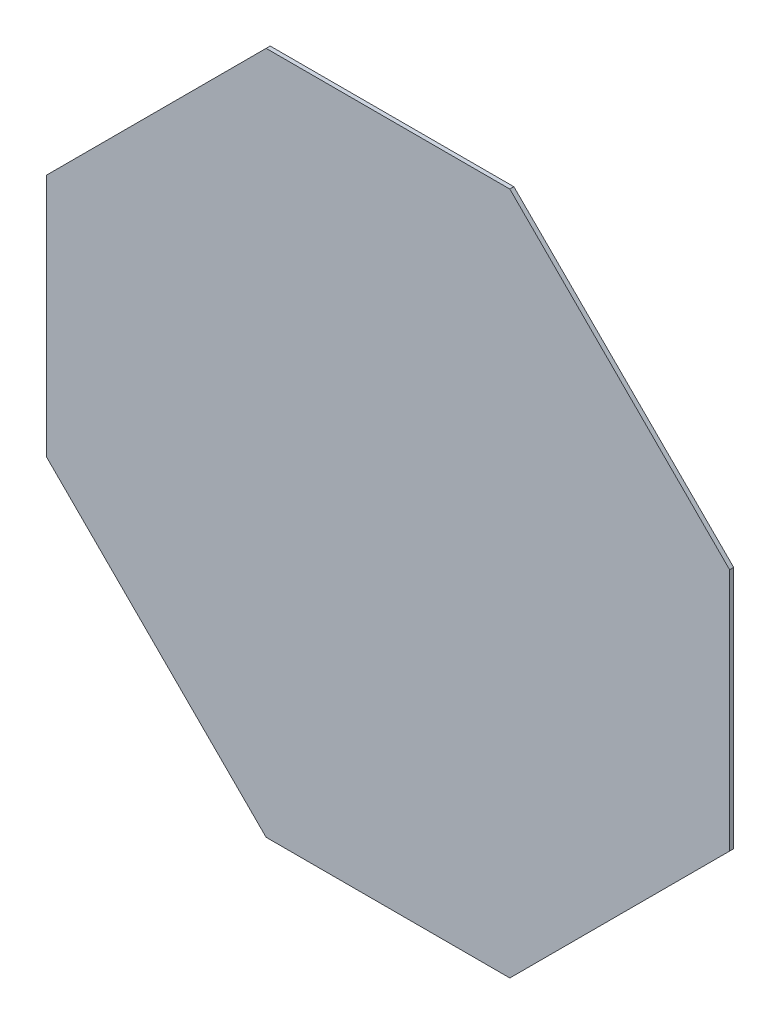
ISO-10303-21;
HEADER;
FILE_DESCRIPTION(('STEP AP214'),'2;1');
FILE_NAME('part.step','',(''),(''),'','','');
FILE_SCHEMA(('AUTOMOTIVE_DESIGN { 1 0 10303 214 1 1 1 1 }'));
ENDSEC;
DATA;
#1=APPLICATION_CONTEXT('core data for automotive mechanical design processes');
#2=APPLICATION_PROTOCOL_DEFINITION('international standard','automotive_design',2000,#1);
#3=PRODUCT_CONTEXT('',#1,'mechanical');
#4=PRODUCT('Part','Part','',(#3));
#5=PRODUCT_RELATED_PRODUCT_CATEGORY('part','',(#4));
#6=PRODUCT_DEFINITION_FORMATION('','',#4);
#7=PRODUCT_DEFINITION_CONTEXT('part definition',#1,'design');
#8=PRODUCT_DEFINITION('design','',#6,#7);
#9=PRODUCT_DEFINITION_SHAPE('','',#8);
#10=(LENGTH_UNIT() NAMED_UNIT(*) SI_UNIT(.MILLI.,.METRE.));
#11=(NAMED_UNIT(*) PLANE_ANGLE_UNIT() SI_UNIT($,.RADIAN.));
#12=(NAMED_UNIT(*) SI_UNIT($,.STERADIAN.) SOLID_ANGLE_UNIT());
#13=UNCERTAINTY_MEASURE_WITH_UNIT(LENGTH_MEASURE(1.E-05),#10,'distance_accuracy_value','');
#14=(GEOMETRIC_REPRESENTATION_CONTEXT(3) GLOBAL_UNCERTAINTY_ASSIGNED_CONTEXT((#13)) GLOBAL_UNIT_ASSIGNED_CONTEXT((#10,
#11,#12)) REPRESENTATION_CONTEXT('',''));
#15=CARTESIAN_POINT('',(0.,0.,0.));
#16=DIRECTION('',(0.,0.,1.));
#17=DIRECTION('',(1.,0.,0.));
#18=AXIS2_PLACEMENT_3D('',#15,#16,#17);
#19=CARTESIAN_POINT('',(164.,-340.242640687119,3.));
#20=DIRECTION('',(-1.,0.,0.));
#21=DIRECTION('',(0.,0.,1.));
#22=AXIS2_PLACEMENT_3D('',#19,#20,#21);
#23=PLANE('',#22);
#24=DIRECTION('',(0.,1.,0.));
#25=VECTOR('',#24,1.);
#26=CARTESIAN_POINT('',(164.,-340.242640687119,0.));
#27=LINE('',#26,#25);
#28=CARTESIAN_POINT('',(164.,-340.242640687119,0.));
#29=VERTEX_POINT('',#28);
#30=CARTESIAN_POINT('',(164.,-159.757359312881,0.));
#31=VERTEX_POINT('',#30);
#32=EDGE_CURVE('E133',#29,#31,#27,.T.);
#33=ORIENTED_EDGE('',*,*,#32,.T.);
#34=DIRECTION('',(0.,0.,-1.));
#35=VECTOR('',#34,1.);
#36=CARTESIAN_POINT('',(164.,-159.757359312881,3.));
#37=LINE('',#36,#35);
#38=CARTESIAN_POINT('',(164.,-159.757359312881,3.));
#39=VERTEX_POINT('',#38);
#40=EDGE_CURVE('E11',#39,#31,#37,.T.);
#41=ORIENTED_EDGE('',*,*,#40,.F.);
#42=DIRECTION('',(0.,1.,0.));
#43=VECTOR('',#42,1.);
#44=CARTESIAN_POINT('',(164.,-340.242640687119,3.));
#45=LINE('',#44,#43);
#46=CARTESIAN_POINT('',(164.,-340.242640687119,3.));
#47=VERTEX_POINT('',#46);
#48=EDGE_CURVE('E147',#47,#39,#45,.T.);
#49=ORIENTED_EDGE('',*,*,#48,.F.);
#50=DIRECTION('',(0.,0.,-1.));
#51=VECTOR('',#50,1.);
#52=CARTESIAN_POINT('',(164.,-340.242640687119,3.));
#53=LINE('',#52,#51);
#54=EDGE_CURVE('E129',#47,#29,#53,.T.);
#55=ORIENTED_EDGE('',*,*,#54,.T.);
#56=EDGE_LOOP('',(#33,#41,#49,#55));
#57=FACE_BOUND('',#56,.T.);
#58=ADVANCED_FACE('F37',(#57),#23,.F.);
#59=CARTESIAN_POINT('',(164.,-159.757359312881,3.));
#60=DIRECTION('',(-0.707106781186547,-0.707106781186548,0.));
#61=DIRECTION('',(0.707106781186548,-0.707106781186547,0.));
#62=AXIS2_PLACEMENT_3D('',#59,#60,#61);
#63=PLANE('',#62);
#64=DIRECTION('',(-0.707106781186548,0.707106781186547,0.));
#65=VECTOR('',#64,1.);
#66=CARTESIAN_POINT('',(164.,-159.757359312881,0.));
#67=LINE('',#66,#65);
#68=CARTESIAN_POINT('',(1.24264068711928,2.99999999999997,0.));
#69=VERTEX_POINT('',#68);
#70=EDGE_CURVE('E136',#31,#69,#67,.T.);
#71=ORIENTED_EDGE('',*,*,#70,.T.);
#72=DIRECTION('',(0.,0.,-1.));
#73=VECTOR('',#72,1.);
#74=CARTESIAN_POINT('',(1.24264068711928,2.99999999999997,3.));
#75=LINE('',#74,#73);
#76=CARTESIAN_POINT('',(1.24264068711928,2.99999999999997,3.));
#77=VERTEX_POINT('',#76);
#78=EDGE_CURVE('E45',#77,#69,#75,.T.);
#79=ORIENTED_EDGE('',*,*,#78,.F.);
#80=DIRECTION('',(-0.707106781186548,0.707106781186547,0.));
#81=VECTOR('',#80,1.);
#82=CARTESIAN_POINT('',(164.,-159.757359312881,3.));
#83=LINE('',#82,#81);
#84=EDGE_CURVE('E96',#39,#77,#83,.T.);
#85=ORIENTED_EDGE('',*,*,#84,.F.);
#86=ORIENTED_EDGE('',*,*,#40,.T.);
#87=EDGE_LOOP('',(#71,#79,#85,#86));
#88=FACE_BOUND('',#87,.T.);
#89=ADVANCED_FACE('F182',(#88),#63,.F.);
#90=CARTESIAN_POINT('',(1.24264068711928,2.99999999999997,3.));
#91=DIRECTION('',(0.,-1.,0.));
#92=DIRECTION('',(1.,0.,0.));
#93=AXIS2_PLACEMENT_3D('',#90,#91,#92);
#94=PLANE('',#93);
#95=DIRECTION('',(-1.,0.,0.));
#96=VECTOR('',#95,1.);
#97=CARTESIAN_POINT('',(1.24264068711928,2.99999999999997,0.));
#98=LINE('',#97,#96);
#99=CARTESIAN_POINT('',(-179.242640687119,2.99999999999994,0.));
#100=VERTEX_POINT('',#99);
#101=EDGE_CURVE('E138',#69,#100,#98,.T.);
#102=ORIENTED_EDGE('',*,*,#101,.T.);
#103=DIRECTION('',(0.,0.,-1.));
#104=VECTOR('',#103,1.);
#105=CARTESIAN_POINT('',(-179.242640687119,2.99999999999994,3.));
#106=LINE('',#105,#104);
#107=CARTESIAN_POINT('',(-179.242640687119,2.99999999999994,3.));
#108=VERTEX_POINT('',#107);
#109=EDGE_CURVE('E154',#108,#100,#106,.T.);
#110=ORIENTED_EDGE('',*,*,#109,.F.);
#111=DIRECTION('',(-1.,0.,0.));
#112=VECTOR('',#111,1.);
#113=CARTESIAN_POINT('',(1.24264068711928,2.99999999999997,3.));
#114=LINE('',#113,#112);
#115=EDGE_CURVE('E162',#77,#108,#114,.T.);
#116=ORIENTED_EDGE('',*,*,#115,.F.);
#117=ORIENTED_EDGE('',*,*,#78,.T.);
#118=EDGE_LOOP('',(#102,#110,#116,#117));
#119=FACE_BOUND('',#118,.T.);
#120=ADVANCED_FACE('F160',(#119),#94,.F.);
#121=CARTESIAN_POINT('',(-179.242640687119,2.99999999999994,3.));
#122=DIRECTION('',(0.707106781186547,-0.707106781186548,0.));
#123=DIRECTION('',(0.707106781186548,0.707106781186547,0.));
#124=AXIS2_PLACEMENT_3D('',#121,#122,#123);
#125=PLANE('',#124);
#126=DIRECTION('',(-0.707106781186548,-0.707106781186547,0.));
#127=VECTOR('',#126,1.);
#128=CARTESIAN_POINT('',(-179.242640687119,2.99999999999994,0.));
#129=LINE('',#128,#127);
#130=CARTESIAN_POINT('',(-342.,-159.757359312881,0.));
#131=VERTEX_POINT('',#130);
#132=EDGE_CURVE('E140',#100,#131,#129,.T.);
#133=ORIENTED_EDGE('',*,*,#132,.T.);
#134=DIRECTION('',(0.,0.,-1.));
#135=VECTOR('',#134,1.);
#136=CARTESIAN_POINT('',(-342.,-159.757359312881,3.));
#137=LINE('',#136,#135);
#138=CARTESIAN_POINT('',(-342.,-159.757359312881,3.));
#139=VERTEX_POINT('',#138);
#140=EDGE_CURVE('E151',#139,#131,#137,.T.);
#141=ORIENTED_EDGE('',*,*,#140,.F.);
#142=DIRECTION('',(-0.707106781186548,-0.707106781186547,0.));
#143=VECTOR('',#142,1.);
#144=CARTESIAN_POINT('',(-179.242640687119,2.99999999999994,3.));
#145=LINE('',#144,#143);
#146=EDGE_CURVE('E174',#108,#139,#145,.T.);
#147=ORIENTED_EDGE('',*,*,#146,.F.);
#148=ORIENTED_EDGE('',*,*,#109,.T.);
#149=EDGE_LOOP('',(#133,#141,#147,#148));
#150=FACE_BOUND('',#149,.T.);
#151=ADVANCED_FACE('F170',(#150),#125,.F.);
#152=CARTESIAN_POINT('',(-342.,-159.757359312881,3.));
#153=DIRECTION('',(1.,0.,0.));
#154=DIRECTION('',(0.,0.,-1.));
#155=AXIS2_PLACEMENT_3D('',#152,#153,#154);
#156=PLANE('',#155);
#157=DIRECTION('',(0.,-1.,0.));
#158=VECTOR('',#157,1.);
#159=CARTESIAN_POINT('',(-342.,-159.757359312881,0.));
#160=LINE('',#159,#158);
#161=CARTESIAN_POINT('',(-342.,-340.242640687119,0.));
#162=VERTEX_POINT('',#161);
#163=EDGE_CURVE('E142',#131,#162,#160,.T.);
#164=ORIENTED_EDGE('',*,*,#163,.T.);
#165=DIRECTION('',(0.,0.,-1.));
#166=VECTOR('',#165,1.);
#167=CARTESIAN_POINT('',(-342.,-340.242640687119,3.));
#168=LINE('',#167,#166);
#169=CARTESIAN_POINT('',(-342.,-340.242640687119,3.));
#170=VERTEX_POINT('',#169);
#171=EDGE_CURVE('E124',#170,#162,#168,.T.);
#172=ORIENTED_EDGE('',*,*,#171,.F.);
#173=DIRECTION('',(0.,-1.,0.));
#174=VECTOR('',#173,1.);
#175=CARTESIAN_POINT('',(-342.,-159.757359312881,3.));
#176=LINE('',#175,#174);
#177=EDGE_CURVE('E115',#139,#170,#176,.T.);
#178=ORIENTED_EDGE('',*,*,#177,.F.);
#179=ORIENTED_EDGE('',*,*,#140,.T.);
#180=EDGE_LOOP('',(#164,#172,#178,#179));
#181=FACE_BOUND('',#180,.T.);
#182=ADVANCED_FACE('F173',(#181),#156,.F.);
#183=CARTESIAN_POINT('',(-342.,-340.242640687119,3.));
#184=DIRECTION('',(0.707106781186548,0.707106781186547,0.));
#185=DIRECTION('',(-0.707106781186547,0.707106781186548,0.));
#186=AXIS2_PLACEMENT_3D('',#183,#184,#185);
#187=PLANE('',#186);
#188=DIRECTION('',(0.707106781186547,-0.707106781186548,0.));
#189=VECTOR('',#188,1.);
#190=CARTESIAN_POINT('',(-342.,-340.242640687119,0.));
#191=LINE('',#190,#189);
#192=CARTESIAN_POINT('',(-179.242640687119,-503.,0.));
#193=VERTEX_POINT('',#192);
#194=EDGE_CURVE('E123',#162,#193,#191,.T.);
#195=ORIENTED_EDGE('',*,*,#194,.T.);
#196=DIRECTION('',(0.,0.,-1.));
#197=VECTOR('',#196,1.);
#198=CARTESIAN_POINT('',(-179.242640687119,-503.,3.));
#199=LINE('',#198,#197);
#200=CARTESIAN_POINT('',(-179.242640687119,-503.,3.));
#201=VERTEX_POINT('',#200);
#202=EDGE_CURVE('E120',#201,#193,#199,.T.);
#203=ORIENTED_EDGE('',*,*,#202,.F.);
#204=DIRECTION('',(0.707106781186547,-0.707106781186548,0.));
#205=VECTOR('',#204,1.);
#206=CARTESIAN_POINT('',(-342.,-340.242640687119,3.));
#207=LINE('',#206,#205);
#208=EDGE_CURVE('E109',#170,#201,#207,.T.);
#209=ORIENTED_EDGE('',*,*,#208,.F.);
#210=ORIENTED_EDGE('',*,*,#171,.T.);
#211=EDGE_LOOP('',(#195,#203,#209,#210));
#212=FACE_BOUND('',#211,.T.);
#213=ADVANCED_FACE('F121',(#212),#187,.F.);
#214=CARTESIAN_POINT('',(-179.242640687119,-503.,3.));
#215=DIRECTION('',(0.,1.,0.));
#216=DIRECTION('',(0.,0.,1.));
#217=AXIS2_PLACEMENT_3D('',#214,#215,#216);
#218=PLANE('',#217);
#219=DIRECTION('',(1.,0.,0.));
#220=VECTOR('',#219,1.);
#221=CARTESIAN_POINT('',(-179.242640687119,-503.,0.));
#222=LINE('',#221,#220);
#223=CARTESIAN_POINT('',(1.24264068711931,-503.,0.));
#224=VERTEX_POINT('',#223);
#225=EDGE_CURVE('E82',#193,#224,#222,.T.);
#226=ORIENTED_EDGE('',*,*,#225,.T.);
#227=DIRECTION('',(0.,0.,-1.));
#228=VECTOR('',#227,1.);
#229=CARTESIAN_POINT('',(1.24264068711931,-503.,3.));
#230=LINE('',#229,#228);
#231=CARTESIAN_POINT('',(1.24264068711931,-503.,3.));
#232=VERTEX_POINT('',#231);
#233=EDGE_CURVE('E125',#232,#224,#230,.T.);
#234=ORIENTED_EDGE('',*,*,#233,.F.);
#235=DIRECTION('',(1.,0.,0.));
#236=VECTOR('',#235,1.);
#237=CARTESIAN_POINT('',(-179.242640687119,-503.,3.));
#238=LINE('',#237,#236);
#239=EDGE_CURVE('E113',#201,#232,#238,.T.);
#240=ORIENTED_EDGE('',*,*,#239,.F.);
#241=ORIENTED_EDGE('',*,*,#202,.T.);
#242=EDGE_LOOP('',(#226,#234,#240,#241));
#243=FACE_BOUND('',#242,.T.);
#244=ADVANCED_FACE('F127',(#243),#218,.F.);
#245=CARTESIAN_POINT('',(1.24264068711931,-503.,3.));
#246=DIRECTION('',(-0.707106781186548,0.707106781186547,0.));
#247=DIRECTION('',(-0.707106781186547,-0.707106781186548,0.));
#248=AXIS2_PLACEMENT_3D('',#245,#246,#247);
#249=PLANE('',#248);
#250=DIRECTION('',(0.707106781186547,0.707106781186548,0.));
#251=VECTOR('',#250,1.);
#252=CARTESIAN_POINT('',(1.24264068711931,-503.,0.));
#253=LINE('',#252,#251);
#254=EDGE_CURVE('E88',#224,#29,#253,.T.);
#255=ORIENTED_EDGE('',*,*,#254,.T.);
#256=ORIENTED_EDGE('',*,*,#54,.F.);
#257=DIRECTION('',(0.707106781186547,0.707106781186548,0.));
#258=VECTOR('',#257,1.);
#259=CARTESIAN_POINT('',(1.24264068711931,-503.,3.));
#260=LINE('',#259,#258);
#261=EDGE_CURVE('E53',#232,#47,#260,.T.);
#262=ORIENTED_EDGE('',*,*,#261,.F.);
#263=ORIENTED_EDGE('',*,*,#233,.T.);
#264=EDGE_LOOP('',(#255,#256,#262,#263));
#265=FACE_BOUND('',#264,.T.);
#266=ADVANCED_FACE('F198',(#265),#249,.F.);
#267=CARTESIAN_POINT('',(0.,0.,3.));
#268=DIRECTION('',(0.,0.,1.));
#269=DIRECTION('',(1.,0.,0.));
#270=AXIS2_PLACEMENT_3D('',#267,#268,#269);
#271=PLANE('',#270);
#272=ORIENTED_EDGE('',*,*,#48,.T.);
#273=ORIENTED_EDGE('',*,*,#84,.T.);
#274=ORIENTED_EDGE('',*,*,#115,.T.);
#275=ORIENTED_EDGE('',*,*,#146,.T.);
#276=ORIENTED_EDGE('',*,*,#177,.T.);
#277=ORIENTED_EDGE('',*,*,#208,.T.);
#278=ORIENTED_EDGE('',*,*,#239,.T.);
#279=ORIENTED_EDGE('',*,*,#261,.T.);
#280=EDGE_LOOP('',(#272,#273,#274,#275,#276,#277,#278,#279));
#281=FACE_BOUND('',#280,.T.);
#282=ADVANCED_FACE('F111',(#281),#271,.T.);
#283=CARTESIAN_POINT('',(0.,0.,0.));
#284=DIRECTION('',(0.,0.,1.));
#285=DIRECTION('',(1.,0.,0.));
#286=AXIS2_PLACEMENT_3D('',#283,#284,#285);
#287=PLANE('',#286);
#288=ORIENTED_EDGE('',*,*,#32,.F.);
#289=ORIENTED_EDGE('',*,*,#254,.F.);
#290=ORIENTED_EDGE('',*,*,#225,.F.);
#291=ORIENTED_EDGE('',*,*,#194,.F.);
#292=ORIENTED_EDGE('',*,*,#163,.F.);
#293=ORIENTED_EDGE('',*,*,#132,.F.);
#294=ORIENTED_EDGE('',*,*,#101,.F.);
#295=ORIENTED_EDGE('',*,*,#70,.F.);
#296=EDGE_LOOP('',(#288,#289,#290,#291,#292,#293,#294,#295));
#297=FACE_BOUND('',#296,.T.);
#298=ADVANCED_FACE('F166',(#297),#287,.F.);
#299=CLOSED_SHELL('',(#58,#89,#120,#151,#182,#213,#244,#266,#282,#298));
#300=MANIFOLD_SOLID_BREP('B2',#299);
#301=ADVANCED_BREP_SHAPE_REPRESENTATION('',(#18,#300),#14);
#302=SHAPE_DEFINITION_REPRESENTATION(#9,#301);
ENDSEC;
END-ISO-10303-21;
